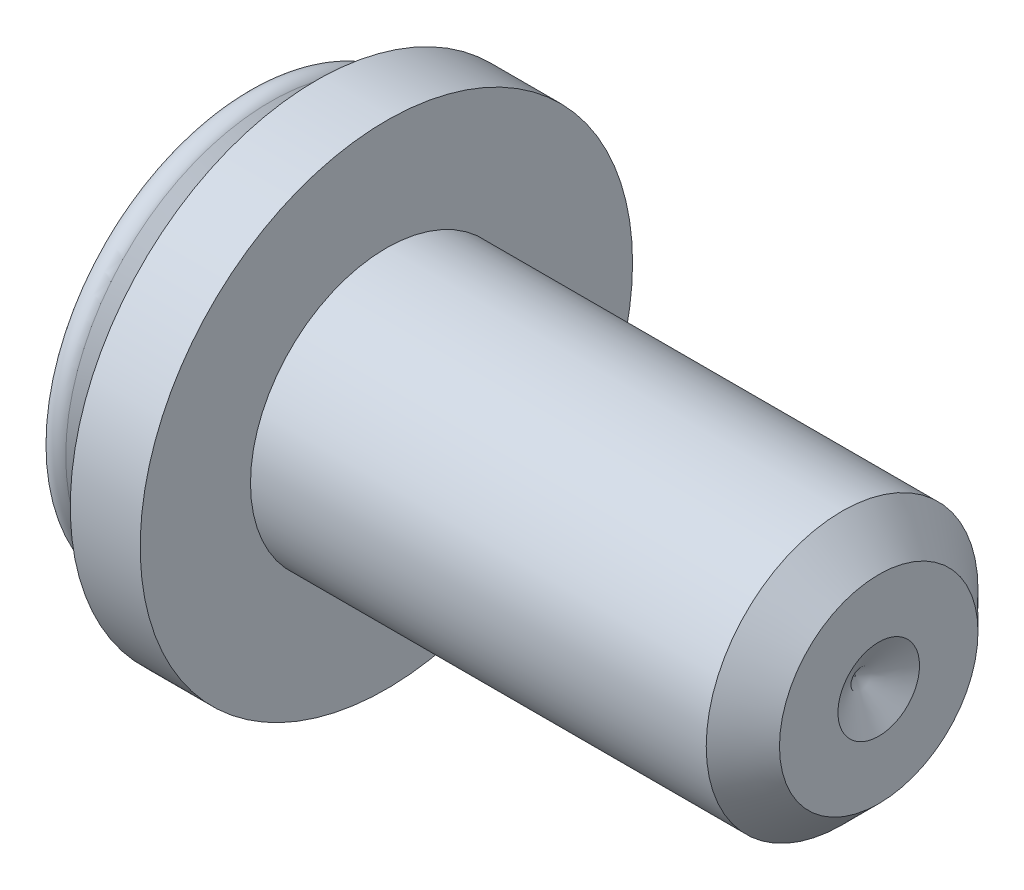
ISO-10303-21;
HEADER;
FILE_DESCRIPTION(('STEP AP214'),'2;1');
FILE_NAME('part.step','',(''),(''),'','','');
FILE_SCHEMA(('AUTOMOTIVE_DESIGN { 1 0 10303 214 1 1 1 1 }'));
ENDSEC;
DATA;
#1=APPLICATION_CONTEXT('core data for automotive mechanical design processes');
#2=APPLICATION_PROTOCOL_DEFINITION('international standard','automotive_design',2000,#1);
#3=PRODUCT_CONTEXT('',#1,'mechanical');
#4=PRODUCT('Part','Part','',(#3));
#5=PRODUCT_RELATED_PRODUCT_CATEGORY('part','',(#4));
#6=PRODUCT_DEFINITION_FORMATION('','',#4);
#7=PRODUCT_DEFINITION_CONTEXT('part definition',#1,'design');
#8=PRODUCT_DEFINITION('design','',#6,#7);
#9=PRODUCT_DEFINITION_SHAPE('','',#8);
#10=(LENGTH_UNIT() NAMED_UNIT(*) SI_UNIT(.MILLI.,.METRE.));
#11=(NAMED_UNIT(*) PLANE_ANGLE_UNIT() SI_UNIT($,.RADIAN.));
#12=(NAMED_UNIT(*) SI_UNIT($,.STERADIAN.) SOLID_ANGLE_UNIT());
#13=UNCERTAINTY_MEASURE_WITH_UNIT(LENGTH_MEASURE(1.E-05),#10,'distance_accuracy_value','');
#14=(GEOMETRIC_REPRESENTATION_CONTEXT(3) GLOBAL_UNCERTAINTY_ASSIGNED_CONTEXT((#13)) GLOBAL_UNIT_ASSIGNED_CONTEXT((#10,
#11,#12)) REPRESENTATION_CONTEXT('',''));
#15=CARTESIAN_POINT('',(0.,0.,0.));
#16=DIRECTION('',(0.,0.,1.));
#17=DIRECTION('',(1.,0.,0.));
#18=AXIS2_PLACEMENT_3D('',#15,#16,#17);
#19=CARTESIAN_POINT('',(-0.9017,-1.373124,-1.3462));
#20=DIRECTION('',(-1.,0.,0.));
#21=DIRECTION('',(0.,0.,1.));
#22=AXIS2_PLACEMENT_3D('',#19,#20,#21);
#23=PLANE('',#22);
#24=CARTESIAN_POINT('',(-0.9017,0.,0.));
#25=DIRECTION('',(-1.,0.,0.));
#26=DIRECTION('',(0.,0.,1.));
#27=AXIS2_PLACEMENT_3D('',#24,#25,#26);
#28=CIRCLE('',#27,1.3462);
#29=CARTESIAN_POINT('',(-0.9017,0.,1.3462));
#30=VERTEX_POINT('',#29);
#31=EDGE_CURVE('E20',#30,#30,#28,.F.);
#32=ORIENTED_EDGE('',*,*,#31,.F.);
#33=EDGE_LOOP('',(#32));
#34=FACE_BOUND('',#33,.T.);
#35=ADVANCED_FACE('F16',(#34),#23,.T.);
#36=CARTESIAN_POINT('',(-0.9017,0.,0.));
#37=DIRECTION('',(-1.,0.,0.));
#38=DIRECTION('',(0.,0.,1.));
#39=AXIS2_PLACEMENT_3D('',#36,#37,#38);
#40=CONICAL_SURFACE('',#39,1.3462,0.197395559849881);
#41=CARTESIAN_POINT('',(-1.8034,0.,0.));
#42=DIRECTION('',(-1.,0.,0.));
#43=DIRECTION('',(0.,0.,1.));
#44=AXIS2_PLACEMENT_3D('',#41,#42,#43);
#45=CIRCLE('',#44,1.52654);
#46=CARTESIAN_POINT('',(-1.8034,0.,1.52654));
#47=VERTEX_POINT('',#46);
#48=EDGE_CURVE('E45',#47,#47,#45,.F.);
#49=ORIENTED_EDGE('',*,*,#48,.F.);
#50=EDGE_LOOP('',(#49));
#51=FACE_BOUND('',#50,.T.);
#52=ORIENTED_EDGE('',*,*,#31,.T.);
#53=EDGE_LOOP('',(#52));
#54=FACE_BOUND('',#53,.T.);
#55=ADVANCED_FACE('F54',(#51,#54),#40,.F.);
#56=CARTESIAN_POINT('',(-1.8034,-2.5623012,-2.51206));
#57=DIRECTION('',(-1.,0.,0.));
#58=DIRECTION('',(0.,0.,1.));
#59=AXIS2_PLACEMENT_3D('',#56,#57,#58);
#60=PLANE('',#59);
#61=CARTESIAN_POINT('',(-1.8034,0.,0.));
#62=DIRECTION('',(1.,0.,0.));
#63=DIRECTION('',(0.,0.,-1.));
#64=AXIS2_PLACEMENT_3D('',#61,#62,#63);
#65=CIRCLE('',#64,2.51205999999932);
#66=CARTESIAN_POINT('',(-1.8034,0.,-2.51205999999932));
#67=VERTEX_POINT('',#66);
#68=EDGE_CURVE('E39',#67,#67,#65,.T.);
#69=ORIENTED_EDGE('',*,*,#68,.F.);
#70=EDGE_LOOP('',(#69));
#71=FACE_BOUND('',#70,.T.);
#72=ORIENTED_EDGE('',*,*,#48,.T.);
#73=EDGE_LOOP('',(#72));
#74=FACE_BOUND('',#73,.T.);
#75=ADVANCED_FACE('F32',(#71,#74),#60,.T.);
#76=CARTESIAN_POINT('',(6.0464407754655,0.,0.));
#77=DIRECTION('',(1.,0.,0.));
#78=DIRECTION('',(0.,0.,-1.));
#79=AXIS2_PLACEMENT_3D('',#76,#77,#78);
#80=CONICAL_SURFACE('',#79,0.,1.04719755119663);
#81=CARTESIAN_POINT('',(6.0464407754655,0.,0.));
#82=VERTEX_POINT('',#81);
#83=VERTEX_LOOP('',#82);
#84=FACE_BOUND('',#83,.T.);
#85=CARTESIAN_POINT('',(6.35,0.,0.));
#86=DIRECTION('',(1.,0.,0.));
#87=DIRECTION('',(0.,0.,-1.));
#88=AXIS2_PLACEMENT_3D('',#85,#86,#87);
#89=CIRCLE('',#88,0.52578);
#90=CARTESIAN_POINT('',(6.35,0.,-0.52578));
#91=VERTEX_POINT('',#90);
#92=EDGE_CURVE('E36',#91,#91,#89,.F.);
#93=ORIENTED_EDGE('',*,*,#92,.F.);
#94=EDGE_LOOP('',(#93));
#95=FACE_BOUND('',#94,.T.);
#96=ADVANCED_FACE('F28',(#84,#95),#80,.F.);
#97=CARTESIAN_POINT('',(6.35,-1.3057632,1.28016));
#98=DIRECTION('',(1.,0.,0.));
#99=DIRECTION('',(0.,0.,-1.));
#100=AXIS2_PLACEMENT_3D('',#97,#98,#99);
#101=PLANE('',#100);
#102=CARTESIAN_POINT('',(6.35,0.,0.));
#103=DIRECTION('',(-1.,0.,0.));
#104=DIRECTION('',(0.,0.,1.));
#105=AXIS2_PLACEMENT_3D('',#102,#103,#104);
#106=CIRCLE('',#105,1.28016);
#107=CARTESIAN_POINT('',(6.35,0.,1.28016));
#108=VERTEX_POINT('',#107);
#109=EDGE_CURVE('E38',#108,#108,#106,.T.);
#110=ORIENTED_EDGE('',*,*,#109,.F.);
#111=EDGE_LOOP('',(#110));
#112=FACE_BOUND('',#111,.T.);
#113=ORIENTED_EDGE('',*,*,#92,.T.);
#114=EDGE_LOOP('',(#113));
#115=FACE_BOUND('',#114,.T.);
#116=ADVANCED_FACE('F31',(#112,#115),#101,.T.);
#117=CARTESIAN_POINT('',(-1.62306,0.,0.));
#118=DIRECTION('',(1.,0.,0.));
#119=DIRECTION('',(0.,0.,-1.));
#120=AXIS2_PLACEMENT_3D('',#117,#118,#119);
#121=TOROIDAL_SURFACE('',#120,2.51206,0.18034);
#122=ORIENTED_EDGE('',*,*,#68,.T.);
#123=EDGE_LOOP('',(#122));
#124=FACE_BOUND('',#123,.T.);
#125=CARTESIAN_POINT('',(-1.4955403630808,0.,0.));
#126=DIRECTION('',(1.,0.,0.));
#127=DIRECTION('',(0.,0.,-1.));
#128=AXIS2_PLACEMENT_3D('',#125,#126,#127);
#129=CIRCLE('',#128,2.6395796369192);
#130=CARTESIAN_POINT('',(-1.4955403630808,0.,-2.6395796369192));
#131=VERTEX_POINT('',#130);
#132=EDGE_CURVE('E42',#131,#131,#129,.T.);
#133=ORIENTED_EDGE('',*,*,#132,.F.);
#134=EDGE_LOOP('',(#133));
#135=FACE_BOUND('',#134,.T.);
#136=ADVANCED_FACE('F100',(#124,#135),#121,.T.);
#137=CARTESIAN_POINT('',(5.87756,0.,0.));
#138=DIRECTION('',(-1.,0.,0.));
#139=DIRECTION('',(0.,0.,1.));
#140=AXIS2_PLACEMENT_3D('',#137,#138,#139);
#141=CONICAL_SURFACE('',#140,1.7526,0.785398163397449);
#142=CARTESIAN_POINT('',(5.87756,0.,0.));
#143=DIRECTION('',(-1.,0.,0.));
#144=DIRECTION('',(0.,0.,1.));
#145=AXIS2_PLACEMENT_3D('',#142,#143,#144);
#146=CIRCLE('',#145,1.7526);
#147=CARTESIAN_POINT('',(5.87756,0.,1.7526));
#148=VERTEX_POINT('',#147);
#149=EDGE_CURVE('E88',#148,#148,#146,.T.);
#150=ORIENTED_EDGE('',*,*,#149,.F.);
#151=EDGE_LOOP('',(#150));
#152=FACE_BOUND('',#151,.T.);
#153=ORIENTED_EDGE('',*,*,#109,.T.);
#154=EDGE_LOOP('',(#153));
#155=FACE_BOUND('',#154,.T.);
#156=ADVANCED_FACE('F102',(#152,#155),#141,.T.);
#157=CARTESIAN_POINT('',(-1.4955403630808,0.,0.));
#158=DIRECTION('',(-1.,0.,0.));
#159=DIRECTION('',(0.,0.,1.));
#160=AXIS2_PLACEMENT_3D('',#157,#158,#159);
#161=CONICAL_SURFACE('',#160,2.6395796369192,0.785398163397619);
#162=ORIENTED_EDGE('',*,*,#132,.T.);
#163=EDGE_LOOP('',(#162));
#164=FACE_BOUND('',#163,.T.);
#165=CARTESIAN_POINT('',(-1.2022666666667,0.,0.));
#166=DIRECTION('',(1.,0.,0.));
#167=DIRECTION('',(0.,0.,-1.));
#168=AXIS2_PLACEMENT_3D('',#165,#166,#167);
#169=CIRCLE('',#168,2.346305940505);
#170=CARTESIAN_POINT('',(-1.2022666666667,0.,-2.346305940505));
#171=VERTEX_POINT('',#170);
#172=EDGE_CURVE('E84',#171,#171,#169,.T.);
#173=ORIENTED_EDGE('',*,*,#172,.F.);
#174=EDGE_LOOP('',(#173));
#175=FACE_BOUND('',#174,.T.);
#176=ADVANCED_FACE('F97',(#164,#175),#161,.T.);
#177=CARTESIAN_POINT('',(0.,0.,0.));
#178=DIRECTION('',(1.,0.,0.));
#179=DIRECTION('',(0.,0.,-1.));
#180=AXIS2_PLACEMENT_3D('',#177,#178,#179);
#181=CYLINDRICAL_SURFACE('',#180,1.7526);
#182=CARTESIAN_POINT('',(0.,0.,0.));
#183=DIRECTION('',(1.,0.,0.));
#184=DIRECTION('',(0.,0.,-1.));
#185=AXIS2_PLACEMENT_3D('',#182,#183,#184);
#186=CIRCLE('',#185,1.7526);
#187=CARTESIAN_POINT('',(0.,0.,-1.7526));
#188=VERTEX_POINT('',#187);
#189=EDGE_CURVE('E80',#188,#188,#186,.F.);
#190=ORIENTED_EDGE('',*,*,#189,.F.);
#191=EDGE_LOOP('',(#190));
#192=FACE_BOUND('',#191,.T.);
#193=ORIENTED_EDGE('',*,*,#149,.T.);
#194=EDGE_LOOP('',(#193));
#195=FACE_BOUND('',#194,.T.);
#196=ADVANCED_FACE('F116',(#192,#195),#181,.T.);
#197=CARTESIAN_POINT('',(-1.2022666666667,0.,0.));
#198=DIRECTION('',(1.,0.,0.));
#199=DIRECTION('',(0.,0.,-1.));
#200=AXIS2_PLACEMENT_3D('',#197,#198,#199);
#201=CYLINDRICAL_SURFACE('',#200,2.346305940505);
#202=ORIENTED_EDGE('',*,*,#172,.T.);
#203=EDGE_LOOP('',(#202));
#204=FACE_BOUND('',#203,.T.);
#205=CARTESIAN_POINT('',(-0.9017,0.,0.));
#206=DIRECTION('',(1.,0.,0.));
#207=DIRECTION('',(0.,0.,-1.));
#208=AXIS2_PLACEMENT_3D('',#205,#206,#207);
#209=CIRCLE('',#208,2.346305940505);
#210=CARTESIAN_POINT('',(-0.9017,0.,-2.346305940505));
#211=VERTEX_POINT('',#210);
#212=EDGE_CURVE('E77',#211,#211,#209,.T.);
#213=ORIENTED_EDGE('',*,*,#212,.F.);
#214=EDGE_LOOP('',(#213));
#215=FACE_BOUND('',#214,.T.);
#216=ADVANCED_FACE('F119',(#204,#215),#201,.T.);
#217=CARTESIAN_POINT('',(0.,-3.2385,3.175));
#218=DIRECTION('',(1.,0.,0.));
#219=DIRECTION('',(0.,0.,-1.));
#220=AXIS2_PLACEMENT_3D('',#217,#218,#219);
#221=PLANE('',#220);
#222=CARTESIAN_POINT('',(0.,0.,0.));
#223=DIRECTION('',(1.,0.,0.));
#224=DIRECTION('',(0.,0.,-1.));
#225=AXIS2_PLACEMENT_3D('',#222,#223,#224);
#226=CIRCLE('',#225,3.175);
#227=CARTESIAN_POINT('',(0.,0.,-3.175));
#228=VERTEX_POINT('',#227);
#229=EDGE_CURVE('E24',#228,#228,#226,.F.);
#230=ORIENTED_EDGE('',*,*,#229,.F.);
#231=EDGE_LOOP('',(#230));
#232=FACE_BOUND('',#231,.T.);
#233=ORIENTED_EDGE('',*,*,#189,.T.);
#234=EDGE_LOOP('',(#233));
#235=FACE_BOUND('',#234,.T.);
#236=ADVANCED_FACE('F70',(#232,#235),#221,.T.);
#237=CARTESIAN_POINT('',(-0.9017,-3.2385,-3.175));
#238=DIRECTION('',(-1.,0.,0.));
#239=DIRECTION('',(0.,0.,1.));
#240=AXIS2_PLACEMENT_3D('',#237,#238,#239);
#241=PLANE('',#240);
#242=ORIENTED_EDGE('',*,*,#212,.T.);
#243=EDGE_LOOP('',(#242));
#244=FACE_BOUND('',#243,.T.);
#245=CARTESIAN_POINT('',(-0.9017,0.,0.));
#246=DIRECTION('',(1.,0.,0.));
#247=DIRECTION('',(0.,0.,-1.));
#248=AXIS2_PLACEMENT_3D('',#245,#246,#247);
#249=CIRCLE('',#248,3.175);
#250=CARTESIAN_POINT('',(-0.9017,0.,-3.175));
#251=VERTEX_POINT('',#250);
#252=EDGE_CURVE('E10',#251,#251,#249,.T.);
#253=ORIENTED_EDGE('',*,*,#252,.F.);
#254=EDGE_LOOP('',(#253));
#255=FACE_BOUND('',#254,.T.);
#256=ADVANCED_FACE('F65',(#244,#255),#241,.T.);
#257=CARTESIAN_POINT('',(-0.9017,0.,0.));
#258=DIRECTION('',(1.,0.,0.));
#259=DIRECTION('',(0.,0.,-1.));
#260=AXIS2_PLACEMENT_3D('',#257,#258,#259);
#261=CYLINDRICAL_SURFACE('',#260,3.175);
#262=ORIENTED_EDGE('',*,*,#252,.T.);
#263=EDGE_LOOP('',(#262));
#264=FACE_BOUND('',#263,.T.);
#265=ORIENTED_EDGE('',*,*,#229,.T.);
#266=EDGE_LOOP('',(#265));
#267=FACE_BOUND('',#266,.T.);
#268=ADVANCED_FACE('F18',(#264,#267),#261,.T.);
#269=CLOSED_SHELL('',(#35,#55,#75,#96,#116,#136,#156,#176,#196,#216,#236,#256,#268));
#270=MANIFOLD_SOLID_BREP('B1',#269);
#271=ADVANCED_BREP_SHAPE_REPRESENTATION('',(#18,#270),#14);
#272=SHAPE_DEFINITION_REPRESENTATION(#9,#271);
ENDSEC;
END-ISO-10303-21;
